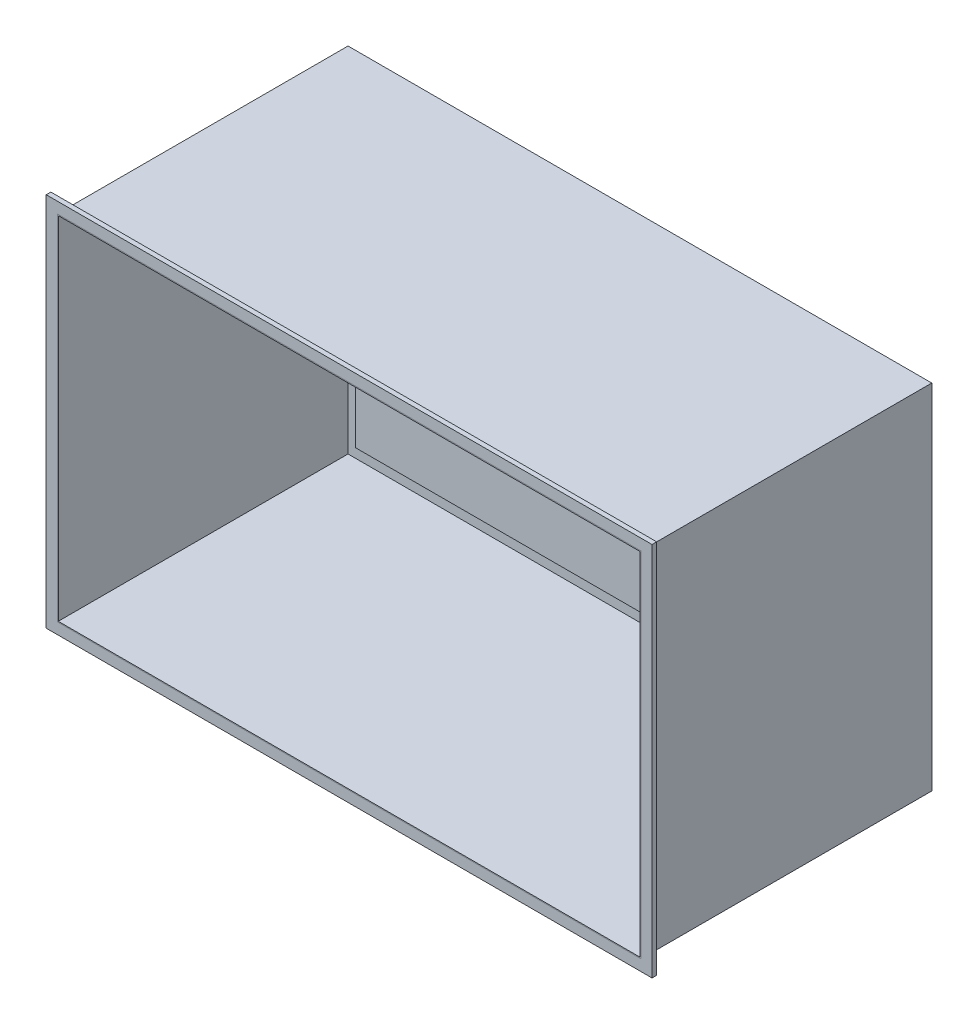
ISO-10303-21;
HEADER;
FILE_DESCRIPTION(('STEP AP214'),'2;1');
FILE_NAME('part.step','',(''),(''),'','','');
FILE_SCHEMA(('AUTOMOTIVE_DESIGN { 1 0 10303 214 1 1 1 1 }'));
ENDSEC;
DATA;
#1=APPLICATION_CONTEXT('core data for automotive mechanical design processes');
#2=APPLICATION_PROTOCOL_DEFINITION('international standard','automotive_design',2000,#1);
#3=PRODUCT_CONTEXT('',#1,'mechanical');
#4=PRODUCT('Part','Part','',(#3));
#5=PRODUCT_RELATED_PRODUCT_CATEGORY('part','',(#4));
#6=PRODUCT_DEFINITION_FORMATION('','',#4);
#7=PRODUCT_DEFINITION_CONTEXT('part definition',#1,'design');
#8=PRODUCT_DEFINITION('design','',#6,#7);
#9=PRODUCT_DEFINITION_SHAPE('','',#8);
#10=(LENGTH_UNIT() NAMED_UNIT(*) SI_UNIT(.MILLI.,.METRE.));
#11=(NAMED_UNIT(*) PLANE_ANGLE_UNIT() SI_UNIT($,.RADIAN.));
#12=(NAMED_UNIT(*) SI_UNIT($,.STERADIAN.) SOLID_ANGLE_UNIT());
#13=UNCERTAINTY_MEASURE_WITH_UNIT(LENGTH_MEASURE(1.E-05),#10,'distance_accuracy_value','');
#14=(GEOMETRIC_REPRESENTATION_CONTEXT(3) GLOBAL_UNCERTAINTY_ASSIGNED_CONTEXT((#13)) GLOBAL_UNIT_ASSIGNED_CONTEXT((#10,
#11,#12)) REPRESENTATION_CONTEXT('',''));
#15=CARTESIAN_POINT('',(0.,0.,0.));
#16=DIRECTION('',(0.,0.,1.));
#17=DIRECTION('',(1.,0.,0.));
#18=AXIS2_PLACEMENT_3D('',#15,#16,#17);
#19=CARTESIAN_POINT('',(411.5,-15.,168.69));
#20=DIRECTION('',(0.,-1.,0.));
#21=DIRECTION('',(1.,0.,0.));
#22=AXIS2_PLACEMENT_3D('',#19,#20,#21);
#23=PLANE('',#22);
#24=DIRECTION('',(1.,0.,0.));
#25=VECTOR('',#24,1.);
#26=CARTESIAN_POINT('',(411.5,-15.,175.));
#27=LINE('',#26,#25);
#28=CARTESIAN_POINT('',(-411.5,-15.0000000000001,175.));
#29=VERTEX_POINT('',#28);
#30=CARTESIAN_POINT('',(411.5,-15.,175.));
#31=VERTEX_POINT('',#30);
#32=EDGE_CURVE('E142',#29,#31,#27,.T.);
#33=ORIENTED_EDGE('',*,*,#32,.F.);
#34=DIRECTION('',(0.,0.,1.));
#35=VECTOR('',#34,1.);
#36=CARTESIAN_POINT('',(-411.5,-15.0000000000001,168.69));
#37=LINE('',#36,#35);
#38=CARTESIAN_POINT('',(-411.5,-15.0000000000001,168.69));
#39=VERTEX_POINT('',#38);
#40=EDGE_CURVE('E12',#39,#29,#37,.T.);
#41=ORIENTED_EDGE('',*,*,#40,.F.);
#42=DIRECTION('',(1.,0.,0.));
#43=VECTOR('',#42,1.);
#44=CARTESIAN_POINT('',(411.5,-15.,168.69));
#45=LINE('',#44,#43);
#46=CARTESIAN_POINT('',(411.5,-15.,168.69));
#47=VERTEX_POINT('',#46);
#48=EDGE_CURVE('E146',#39,#47,#45,.T.);
#49=ORIENTED_EDGE('',*,*,#48,.T.);
#50=DIRECTION('',(0.,0.,1.));
#51=VECTOR('',#50,1.);
#52=CARTESIAN_POINT('',(411.5,-15.,168.69));
#53=LINE('',#52,#51);
#54=EDGE_CURVE('E47',#47,#31,#53,.T.);
#55=ORIENTED_EDGE('',*,*,#54,.T.);
#56=EDGE_LOOP('',(#33,#41,#49,#55));
#57=FACE_BOUND('',#56,.T.);
#58=ADVANCED_FACE('F44',(#57),#23,.T.);
#59=CARTESIAN_POINT('',(-411.5,-15.0000000000001,168.69));
#60=DIRECTION('',(-1.,0.,0.));
#61=DIRECTION('',(0.,0.,1.));
#62=AXIS2_PLACEMENT_3D('',#59,#60,#61);
#63=PLANE('',#62);
#64=DIRECTION('',(0.,-1.,0.));
#65=VECTOR('',#64,1.);
#66=CARTESIAN_POINT('',(-411.5,-15.0000000000001,175.));
#67=LINE('',#66,#65);
#68=CARTESIAN_POINT('',(-411.5,495.,175.));
#69=VERTEX_POINT('',#68);
#70=EDGE_CURVE('E150',#69,#29,#67,.T.);
#71=ORIENTED_EDGE('',*,*,#70,.F.);
#72=DIRECTION('',(0.,0.,1.));
#73=VECTOR('',#72,1.);
#74=CARTESIAN_POINT('',(-411.5,495.,168.69));
#75=LINE('',#74,#73);
#76=CARTESIAN_POINT('',(-411.5,495.,168.69));
#77=VERTEX_POINT('',#76);
#78=EDGE_CURVE('E52',#77,#69,#75,.T.);
#79=ORIENTED_EDGE('',*,*,#78,.F.);
#80=DIRECTION('',(0.,-1.,0.));
#81=VECTOR('',#80,1.);
#82=CARTESIAN_POINT('',(-411.5,-15.0000000000001,168.69));
#83=LINE('',#82,#81);
#84=EDGE_CURVE('E156',#77,#39,#83,.T.);
#85=ORIENTED_EDGE('',*,*,#84,.T.);
#86=ORIENTED_EDGE('',*,*,#40,.T.);
#87=EDGE_LOOP('',(#71,#79,#85,#86));
#88=FACE_BOUND('',#87,.T.);
#89=ADVANCED_FACE('F182',(#88),#63,.T.);
#90=CARTESIAN_POINT('',(-411.5,495.,168.69));
#91=DIRECTION('',(0.,1.,0.));
#92=DIRECTION('',(0.,0.,1.));
#93=AXIS2_PLACEMENT_3D('',#90,#91,#92);
#94=PLANE('',#93);
#95=DIRECTION('',(-1.,0.,0.));
#96=VECTOR('',#95,1.);
#97=CARTESIAN_POINT('',(-411.5,495.,175.));
#98=LINE('',#97,#96);
#99=CARTESIAN_POINT('',(411.5,495.,175.));
#100=VERTEX_POINT('',#99);
#101=EDGE_CURVE('E164',#100,#69,#98,.T.);
#102=ORIENTED_EDGE('',*,*,#101,.F.);
#103=DIRECTION('',(0.,0.,1.));
#104=VECTOR('',#103,1.);
#105=CARTESIAN_POINT('',(411.5,495.,168.69));
#106=LINE('',#105,#104);
#107=CARTESIAN_POINT('',(411.5,495.,168.69));
#108=VERTEX_POINT('',#107);
#109=EDGE_CURVE('E169',#108,#100,#106,.T.);
#110=ORIENTED_EDGE('',*,*,#109,.F.);
#111=DIRECTION('',(-1.,0.,0.));
#112=VECTOR('',#111,1.);
#113=CARTESIAN_POINT('',(-411.5,495.,168.69));
#114=LINE('',#113,#112);
#115=EDGE_CURVE('E153',#108,#77,#114,.T.);
#116=ORIENTED_EDGE('',*,*,#115,.T.);
#117=ORIENTED_EDGE('',*,*,#78,.T.);
#118=EDGE_LOOP('',(#102,#110,#116,#117));
#119=FACE_BOUND('',#118,.T.);
#120=ADVANCED_FACE('F186',(#119),#94,.T.);
#121=CARTESIAN_POINT('',(411.5,495.,168.69));
#122=DIRECTION('',(1.,0.,0.));
#123=DIRECTION('',(0.,1.,0.));
#124=AXIS2_PLACEMENT_3D('',#121,#122,#123);
#125=PLANE('',#124);
#126=DIRECTION('',(0.,1.,0.));
#127=VECTOR('',#126,1.);
#128=CARTESIAN_POINT('',(411.5,495.,175.));
#129=LINE('',#128,#127);
#130=EDGE_CURVE('E161',#31,#100,#129,.T.);
#131=ORIENTED_EDGE('',*,*,#130,.F.);
#132=ORIENTED_EDGE('',*,*,#54,.F.);
#133=DIRECTION('',(0.,1.,0.));
#134=VECTOR('',#133,1.);
#135=CARTESIAN_POINT('',(411.5,495.,168.69));
#136=LINE('',#135,#134);
#137=EDGE_CURVE('E149',#47,#108,#136,.T.);
#138=ORIENTED_EDGE('',*,*,#137,.T.);
#139=ORIENTED_EDGE('',*,*,#109,.T.);
#140=EDGE_LOOP('',(#131,#132,#138,#139));
#141=FACE_BOUND('',#140,.T.);
#142=ADVANCED_FACE('F177',(#141),#125,.T.);
#143=CARTESIAN_POINT('',(0.,0.,168.69));
#144=DIRECTION('',(0.,0.,-1.));
#145=DIRECTION('',(-1.,0.,0.));
#146=AXIS2_PLACEMENT_3D('',#143,#144,#145);
#147=PLANE('',#146);
#148=DIRECTION('',(0.,-1.,0.));
#149=VECTOR('',#148,1.);
#150=CARTESIAN_POINT('',(-396.5,0.,168.69));
#151=LINE('',#150,#149);
#152=CARTESIAN_POINT('',(-396.5,480.,168.69));
#153=VERTEX_POINT('',#152);
#154=CARTESIAN_POINT('',(-396.5,0.,168.69));
#155=VERTEX_POINT('',#154);
#156=EDGE_CURVE('E111',#153,#155,#151,.T.);
#157=ORIENTED_EDGE('',*,*,#156,.T.);
#158=DIRECTION('',(1.,0.,0.));
#159=VECTOR('',#158,1.);
#160=CARTESIAN_POINT('',(396.5,0.,168.69));
#161=LINE('',#160,#159);
#162=CARTESIAN_POINT('',(396.5,0.,168.69));
#163=VERTEX_POINT('',#162);
#164=EDGE_CURVE('E120',#155,#163,#161,.T.);
#165=ORIENTED_EDGE('',*,*,#164,.T.);
#166=DIRECTION('',(0.,1.,0.));
#167=VECTOR('',#166,1.);
#168=CARTESIAN_POINT('',(396.5,480.,168.69));
#169=LINE('',#168,#167);
#170=CARTESIAN_POINT('',(396.5,480.,168.69));
#171=VERTEX_POINT('',#170);
#172=EDGE_CURVE('E60',#163,#171,#169,.T.);
#173=ORIENTED_EDGE('',*,*,#172,.T.);
#174=DIRECTION('',(-1.,0.,0.));
#175=VECTOR('',#174,1.);
#176=CARTESIAN_POINT('',(-396.5,480.,168.69));
#177=LINE('',#176,#175);
#178=EDGE_CURVE('E117',#171,#153,#177,.T.);
#179=ORIENTED_EDGE('',*,*,#178,.T.);
#180=EDGE_LOOP('',(#157,#165,#173,#179));
#181=FACE_BOUND('',#180,.T.);
#182=ORIENTED_EDGE('',*,*,#48,.F.);
#183=ORIENTED_EDGE('',*,*,#84,.F.);
#184=ORIENTED_EDGE('',*,*,#115,.F.);
#185=ORIENTED_EDGE('',*,*,#137,.F.);
#186=EDGE_LOOP('',(#182,#183,#184,#185));
#187=FACE_BOUND('',#186,.T.);
#188=ADVANCED_FACE('F124',(#181,#187),#147,.T.);
#189=CARTESIAN_POINT('',(0.,0.,175.));
#190=DIRECTION('',(0.,0.,-1.));
#191=DIRECTION('',(-1.,0.,0.));
#192=AXIS2_PLACEMENT_3D('',#189,#190,#191);
#193=PLANE('',#192);
#194=DIRECTION('',(1.,0.,0.));
#195=VECTOR('',#194,1.);
#196=CARTESIAN_POINT('',(396.5,0.,175.));
#197=LINE('',#196,#195);
#198=CARTESIAN_POINT('',(-396.5,0.,175.));
#199=VERTEX_POINT('',#198);
#200=CARTESIAN_POINT('',(396.5,0.,175.));
#201=VERTEX_POINT('',#200);
#202=EDGE_CURVE('E136',#199,#201,#197,.T.);
#203=ORIENTED_EDGE('',*,*,#202,.F.);
#204=DIRECTION('',(0.,-1.,0.));
#205=VECTOR('',#204,1.);
#206=CARTESIAN_POINT('',(-396.5,0.,175.));
#207=LINE('',#206,#205);
#208=CARTESIAN_POINT('',(-396.5,480.,175.));
#209=VERTEX_POINT('',#208);
#210=EDGE_CURVE('E68',#209,#199,#207,.T.);
#211=ORIENTED_EDGE('',*,*,#210,.F.);
#212=DIRECTION('',(-1.,0.,0.));
#213=VECTOR('',#212,1.);
#214=CARTESIAN_POINT('',(-396.5,480.,175.));
#215=LINE('',#214,#213);
#216=CARTESIAN_POINT('',(396.5,480.,175.));
#217=VERTEX_POINT('',#216);
#218=EDGE_CURVE('E127',#217,#209,#215,.T.);
#219=ORIENTED_EDGE('',*,*,#218,.F.);
#220=DIRECTION('',(0.,1.,0.));
#221=VECTOR('',#220,1.);
#222=CARTESIAN_POINT('',(396.5,480.,175.));
#223=LINE('',#222,#221);
#224=EDGE_CURVE('E130',#201,#217,#223,.T.);
#225=ORIENTED_EDGE('',*,*,#224,.F.);
#226=EDGE_LOOP('',(#203,#211,#219,#225));
#227=FACE_BOUND('',#226,.T.);
#228=ORIENTED_EDGE('',*,*,#32,.T.);
#229=ORIENTED_EDGE('',*,*,#130,.T.);
#230=ORIENTED_EDGE('',*,*,#101,.T.);
#231=ORIENTED_EDGE('',*,*,#70,.T.);
#232=EDGE_LOOP('',(#228,#229,#230,#231));
#233=FACE_BOUND('',#232,.T.);
#234=ADVANCED_FACE('F179',(#227,#233),#193,.F.);
#235=CARTESIAN_POINT('',(-396.5,0.,168.69));
#236=DIRECTION('',(-1.,0.,0.));
#237=DIRECTION('',(0.,0.,1.));
#238=AXIS2_PLACEMENT_3D('',#235,#236,#237);
#239=PLANE('',#238);
#240=ORIENTED_EDGE('',*,*,#210,.T.);
#241=DIRECTION('',(0.,0.,1.));
#242=VECTOR('',#241,1.);
#243=CARTESIAN_POINT('',(-396.5,0.,168.69));
#244=LINE('',#243,#242);
#245=EDGE_CURVE('E107',#155,#199,#244,.T.);
#246=ORIENTED_EDGE('',*,*,#245,.F.);
#247=ORIENTED_EDGE('',*,*,#156,.F.);
#248=DIRECTION('',(0.,0.,1.));
#249=VECTOR('',#248,1.);
#250=CARTESIAN_POINT('',(-396.5,480.,168.69));
#251=LINE('',#250,#249);
#252=EDGE_CURVE('E140',#153,#209,#251,.T.);
#253=ORIENTED_EDGE('',*,*,#252,.T.);
#254=EDGE_LOOP('',(#240,#246,#247,#253));
#255=FACE_BOUND('',#254,.T.);
#256=ADVANCED_FACE('F109',(#255),#239,.F.);
#257=CARTESIAN_POINT('',(-396.5,480.,168.69));
#258=DIRECTION('',(0.,1.,0.));
#259=DIRECTION('',(0.,0.,1.));
#260=AXIS2_PLACEMENT_3D('',#257,#258,#259);
#261=PLANE('',#260);
#262=ORIENTED_EDGE('',*,*,#218,.T.);
#263=ORIENTED_EDGE('',*,*,#252,.F.);
#264=ORIENTED_EDGE('',*,*,#178,.F.);
#265=DIRECTION('',(0.,0.,1.));
#266=VECTOR('',#265,1.);
#267=CARTESIAN_POINT('',(396.5,480.,168.69));
#268=LINE('',#267,#266);
#269=EDGE_CURVE('E143',#171,#217,#268,.T.);
#270=ORIENTED_EDGE('',*,*,#269,.T.);
#271=EDGE_LOOP('',(#262,#263,#264,#270));
#272=FACE_BOUND('',#271,.T.);
#273=ADVANCED_FACE('F237',(#272),#261,.F.);
#274=CARTESIAN_POINT('',(396.5,480.,168.69));
#275=DIRECTION('',(1.,0.,0.));
#276=DIRECTION('',(0.,0.,-1.));
#277=AXIS2_PLACEMENT_3D('',#274,#275,#276);
#278=PLANE('',#277);
#279=ORIENTED_EDGE('',*,*,#224,.T.);
#280=ORIENTED_EDGE('',*,*,#269,.F.);
#281=ORIENTED_EDGE('',*,*,#172,.F.);
#282=DIRECTION('',(0.,0.,1.));
#283=VECTOR('',#282,1.);
#284=CARTESIAN_POINT('',(396.5,0.,168.69));
#285=LINE('',#284,#283);
#286=EDGE_CURVE('E116',#163,#201,#285,.T.);
#287=ORIENTED_EDGE('',*,*,#286,.T.);
#288=EDGE_LOOP('',(#279,#280,#281,#287));
#289=FACE_BOUND('',#288,.T.);
#290=ADVANCED_FACE('F246',(#289),#278,.F.);
#291=CARTESIAN_POINT('',(396.5,0.,168.69));
#292=DIRECTION('',(0.,-1.,0.));
#293=DIRECTION('',(0.,0.,-1.));
#294=AXIS2_PLACEMENT_3D('',#291,#292,#293);
#295=PLANE('',#294);
#296=ORIENTED_EDGE('',*,*,#202,.T.);
#297=ORIENTED_EDGE('',*,*,#286,.F.);
#298=ORIENTED_EDGE('',*,*,#164,.F.);
#299=ORIENTED_EDGE('',*,*,#245,.T.);
#300=EDGE_LOOP('',(#296,#297,#298,#299));
#301=FACE_BOUND('',#300,.T.);
#302=ADVANCED_FACE('F121',(#301),#295,.F.);
#303=CLOSED_SHELL('',(#58,#89,#120,#142,#188,#234,#256,#273,#290,#302));
#304=MANIFOLD_SOLID_BREP('B2',#303);
#305=CARTESIAN_POINT('',(396.5,480.,-220.));
#306=DIRECTION('',(-1.,0.,0.));
#307=DIRECTION('',(0.,0.,1.));
#308=AXIS2_PLACEMENT_3D('',#305,#306,#307);
#309=PLANE('',#308);
#310=DIRECTION('',(0.,0.,-1.));
#311=VECTOR('',#310,1.);
#312=CARTESIAN_POINT('',(396.5,480.,-220.));
#313=LINE('',#312,#311);
#314=CARTESIAN_POINT('',(396.5,480.,175.));
#315=VERTEX_POINT('',#314);
#316=CARTESIAN_POINT('',(396.5,480.,-220.));
#317=VERTEX_POINT('',#316);
#318=EDGE_CURVE('E435',#315,#317,#313,.T.);
#319=ORIENTED_EDGE('',*,*,#318,.F.);
#320=DIRECTION('',(0.,1.,0.));
#321=VECTOR('',#320,1.);
#322=CARTESIAN_POINT('',(396.5,0.,175.));
#323=LINE('',#322,#321);
#324=CARTESIAN_POINT('',(396.5,0.,175.));
#325=VERTEX_POINT('',#324);
#326=EDGE_CURVE('E395',#325,#315,#323,.T.);
#327=ORIENTED_EDGE('',*,*,#326,.F.);
#328=DIRECTION('',(0.,0.,-1.));
#329=VECTOR('',#328,1.);
#330=CARTESIAN_POINT('',(396.5,0.,-220.));
#331=LINE('',#330,#329);
#332=CARTESIAN_POINT('',(396.5,0.,-220.));
#333=VERTEX_POINT('',#332);
#334=EDGE_CURVE('E420',#325,#333,#331,.T.);
#335=ORIENTED_EDGE('',*,*,#334,.T.);
#336=DIRECTION('',(0.,-1.,0.));
#337=VECTOR('',#336,1.);
#338=CARTESIAN_POINT('',(396.5,480.,-220.));
#339=LINE('',#338,#337);
#340=EDGE_CURVE('E451',#317,#333,#339,.T.);
#341=ORIENTED_EDGE('',*,*,#340,.F.);
#342=EDGE_LOOP('',(#319,#327,#335,#341));
#343=FACE_BOUND('',#342,.T.);
#344=ADVANCED_FACE('F273',(#343),#309,.F.);
#345=CARTESIAN_POINT('',(-396.5,480.,-220.));
#346=DIRECTION('',(0.,0.,1.));
#347=DIRECTION('',(1.,0.,0.));
#348=AXIS2_PLACEMENT_3D('',#345,#346,#347);
#349=PLANE('',#348);
#350=DIRECTION('',(-1.,0.,0.));
#351=VECTOR('',#350,1.);
#352=CARTESIAN_POINT('',(-396.5,0.,-220.));
#353=LINE('',#352,#351);
#354=CARTESIAN_POINT('',(-396.5,0.,-220.));
#355=VERTEX_POINT('',#354);
#356=EDGE_CURVE('E445',#333,#355,#353,.T.);
#357=ORIENTED_EDGE('',*,*,#356,.T.);
#358=DIRECTION('',(0.,-1.,0.));
#359=VECTOR('',#358,1.);
#360=CARTESIAN_POINT('',(-396.5,480.,-220.));
#361=LINE('',#360,#359);
#362=CARTESIAN_POINT('',(-396.5,480.,-220.));
#363=VERTEX_POINT('',#362);
#364=EDGE_CURVE('E443',#363,#355,#361,.T.);
#365=ORIENTED_EDGE('',*,*,#364,.F.);
#366=DIRECTION('',(-1.,0.,0.));
#367=VECTOR('',#366,1.);
#368=CARTESIAN_POINT('',(-396.5,480.,-220.));
#369=LINE('',#368,#367);
#370=EDGE_CURVE('E437',#317,#363,#369,.T.);
#371=ORIENTED_EDGE('',*,*,#370,.F.);
#372=ORIENTED_EDGE('',*,*,#340,.T.);
#373=EDGE_LOOP('',(#357,#365,#371,#372));
#374=FACE_BOUND('',#373,.T.);
#375=ADVANCED_FACE('F504',(#374),#349,.F.);
#376=CARTESIAN_POINT('',(-396.5,480.,-220.));
#377=DIRECTION('',(1.,0.,0.));
#378=DIRECTION('',(0.,0.,-1.));
#379=AXIS2_PLACEMENT_3D('',#376,#377,#378);
#380=PLANE('',#379);
#381=DIRECTION('',(0.,0.,1.));
#382=VECTOR('',#381,1.);
#383=CARTESIAN_POINT('',(-396.5,0.,-220.));
#384=LINE('',#383,#382);
#385=CARTESIAN_POINT('',(-396.5,0.,175.));
#386=VERTEX_POINT('',#385);
#387=EDGE_CURVE('E438',#355,#386,#384,.T.);
#388=ORIENTED_EDGE('',*,*,#387,.T.);
#389=DIRECTION('',(0.,-1.,0.));
#390=VECTOR('',#389,1.);
#391=CARTESIAN_POINT('',(-396.5,0.,175.));
#392=LINE('',#391,#390);
#393=CARTESIAN_POINT('',(-396.5,480.,175.));
#394=VERTEX_POINT('',#393);
#395=EDGE_CURVE('E403',#394,#386,#392,.T.);
#396=ORIENTED_EDGE('',*,*,#395,.F.);
#397=DIRECTION('',(0.,0.,1.));
#398=VECTOR('',#397,1.);
#399=CARTESIAN_POINT('',(-396.5,480.,-220.));
#400=LINE('',#399,#398);
#401=EDGE_CURVE('E440',#363,#394,#400,.T.);
#402=ORIENTED_EDGE('',*,*,#401,.F.);
#403=ORIENTED_EDGE('',*,*,#364,.T.);
#404=EDGE_LOOP('',(#388,#396,#402,#403));
#405=FACE_BOUND('',#404,.T.);
#406=ADVANCED_FACE('F502',(#405),#380,.F.);
#407=CARTESIAN_POINT('',(0.,480.,0.));
#408=DIRECTION('',(0.,1.,0.));
#409=DIRECTION('',(0.,0.,1.));
#410=AXIS2_PLACEMENT_3D('',#407,#408,#409);
#411=PLANE('',#410);
#412=DIRECTION('',(-1.,0.,0.));
#413=VECTOR('',#412,1.);
#414=CARTESIAN_POINT('',(-396.5,480.,175.));
#415=LINE('',#414,#413);
#416=EDGE_CURVE('E401',#315,#394,#415,.T.);
#417=ORIENTED_EDGE('',*,*,#416,.F.);
#418=ORIENTED_EDGE('',*,*,#318,.T.);
#419=ORIENTED_EDGE('',*,*,#370,.T.);
#420=ORIENTED_EDGE('',*,*,#401,.T.);
#421=EDGE_LOOP('',(#417,#418,#419,#420));
#422=FACE_BOUND('',#421,.T.);
#423=ADVANCED_FACE('F478',(#422),#411,.T.);
#424=CARTESIAN_POINT('',(0.,0.,0.));
#425=DIRECTION('',(0.,1.,0.));
#426=DIRECTION('',(0.,0.,1.));
#427=AXIS2_PLACEMENT_3D('',#424,#425,#426);
#428=PLANE('',#427);
#429=CARTESIAN_POINT('',(372.5,0.,-67.4));
#430=DIRECTION('',(0.,-1.,0.));
#431=DIRECTION('',(0.,0.,-1.));
#432=AXIS2_PLACEMENT_3D('',#429,#430,#431);
#433=CIRCLE('',#432,12.7);
#434=CARTESIAN_POINT('',(372.5,0.,-80.1));
#435=VERTEX_POINT('',#434);
#436=EDGE_CURVE('E460',#435,#435,#433,.T.);
#437=ORIENTED_EDGE('',*,*,#436,.F.);
#438=EDGE_LOOP('',(#437));
#439=FACE_BOUND('',#438,.T.);
#440=CARTESIAN_POINT('',(372.5,0.,-17.));
#441=DIRECTION('',(0.,-1.,0.));
#442=DIRECTION('',(0.,0.,-1.));
#443=AXIS2_PLACEMENT_3D('',#440,#441,#442);
#444=CIRCLE('',#443,12.7);
#445=CARTESIAN_POINT('',(372.5,0.,-29.7));
#446=VERTEX_POINT('',#445);
#447=EDGE_CURVE('E465',#446,#446,#444,.T.);
#448=ORIENTED_EDGE('',*,*,#447,.F.);
#449=EDGE_LOOP('',(#448));
#450=FACE_BOUND('',#449,.T.);
#451=CARTESIAN_POINT('',(372.5,0.,-117.8));
#452=DIRECTION('',(0.,-1.,0.));
#453=DIRECTION('',(0.,0.,-1.));
#454=AXIS2_PLACEMENT_3D('',#451,#452,#453);
#455=CIRCLE('',#454,12.7);
#456=CARTESIAN_POINT('',(372.5,0.,-130.5));
#457=VERTEX_POINT('',#456);
#458=EDGE_CURVE('E387',#457,#457,#455,.T.);
#459=ORIENTED_EDGE('',*,*,#458,.F.);
#460=EDGE_LOOP('',(#459));
#461=FACE_BOUND('',#460,.T.);
#462=ORIENTED_EDGE('',*,*,#334,.F.);
#463=DIRECTION('',(1.,0.,0.));
#464=VECTOR('',#463,1.);
#465=CARTESIAN_POINT('',(-396.5,0.,175.));
#466=LINE('',#465,#464);
#467=EDGE_CURVE('E405',#386,#325,#466,.T.);
#468=ORIENTED_EDGE('',*,*,#467,.F.);
#469=ORIENTED_EDGE('',*,*,#387,.F.);
#470=ORIENTED_EDGE('',*,*,#356,.F.);
#471=EDGE_LOOP('',(#462,#468,#469,#470));
#472=FACE_BOUND('',#471,.T.);
#473=ADVANCED_FACE('F474',(#439,#450,#461,#472),#428,.F.);
#474=CARTESIAN_POINT('',(395.14,480.,-220.));
#475=DIRECTION('',(-1.,0.,0.));
#476=DIRECTION('',(0.,0.,1.));
#477=AXIS2_PLACEMENT_3D('',#474,#475,#476);
#478=PLANE('',#477);
#479=DIRECTION('',(0.,-1.,0.));
#480=VECTOR('',#479,1.);
#481=CARTESIAN_POINT('',(395.14,480.,175.));
#482=LINE('',#481,#480);
#483=CARTESIAN_POINT('',(395.14,478.64,175.));
#484=VERTEX_POINT('',#483);
#485=CARTESIAN_POINT('',(395.14,1.36000000000003,175.));
#486=VERTEX_POINT('',#485);
#487=EDGE_CURVE('E409',#484,#486,#482,.T.);
#488=ORIENTED_EDGE('',*,*,#487,.F.);
#489=DIRECTION('',(0.,0.,-1.));
#490=VECTOR('',#489,1.);
#491=CARTESIAN_POINT('',(395.14,478.64,-220.));
#492=LINE('',#491,#490);
#493=CARTESIAN_POINT('',(395.14,478.64,-218.64));
#494=VERTEX_POINT('',#493);
#495=EDGE_CURVE('E422',#484,#494,#492,.T.);
#496=ORIENTED_EDGE('',*,*,#495,.T.);
#497=DIRECTION('',(0.,-1.,0.));
#498=VECTOR('',#497,1.);
#499=CARTESIAN_POINT('',(395.14,480.,-218.64));
#500=LINE('',#499,#498);
#501=CARTESIAN_POINT('',(395.14,1.36,-218.64));
#502=VERTEX_POINT('',#501);
#503=EDGE_CURVE('E417',#494,#502,#500,.T.);
#504=ORIENTED_EDGE('',*,*,#503,.T.);
#505=DIRECTION('',(0.,0.,-1.));
#506=VECTOR('',#505,1.);
#507=CARTESIAN_POINT('',(395.14,1.36000000000003,-220.));
#508=LINE('',#507,#506);
#509=EDGE_CURVE('E414',#486,#502,#508,.T.);
#510=ORIENTED_EDGE('',*,*,#509,.F.);
#511=EDGE_LOOP('',(#488,#496,#504,#510));
#512=FACE_BOUND('',#511,.T.);
#513=ADVANCED_FACE('F477',(#512),#478,.T.);
#514=CARTESIAN_POINT('',(-396.5,480.,-218.64));
#515=DIRECTION('',(0.,0.,1.));
#516=DIRECTION('',(1.,0.,0.));
#517=AXIS2_PLACEMENT_3D('',#514,#515,#516);
#518=PLANE('',#517);
#519=DIRECTION('',(0.,-1.,0.));
#520=VECTOR('',#519,1.);
#521=CARTESIAN_POINT('',(-379.435502159656,480.,-218.64));
#522=LINE('',#521,#520);
#523=CARTESIAN_POINT('',(-379.435502159656,466.769078929809,-218.64));
#524=VERTEX_POINT('',#523);
#525=CARTESIAN_POINT('',(-379.435502159656,19.444734610378,-218.64));
#526=VERTEX_POINT('',#525);
#527=EDGE_CURVE('E42',#524,#526,#522,.T.);
#528=ORIENTED_EDGE('',*,*,#527,.F.);
#529=DIRECTION('',(-1.,0.,0.));
#530=VECTOR('',#529,1.);
#531=CARTESIAN_POINT('',(-396.5,466.769078929809,-218.64));
#532=LINE('',#531,#530);
#533=CARTESIAN_POINT('',(375.280437732553,466.769078929809,-218.64));
#534=VERTEX_POINT('',#533);
#535=EDGE_CURVE('E365',#534,#524,#532,.T.);
#536=ORIENTED_EDGE('',*,*,#535,.F.);
#537=DIRECTION('',(0.,1.,0.));
#538=VECTOR('',#537,1.);
#539=CARTESIAN_POINT('',(375.280437732553,480.,-218.64));
#540=LINE('',#539,#538);
#541=CARTESIAN_POINT('',(375.280437732553,19.444734610378,-218.64));
#542=VERTEX_POINT('',#541);
#543=EDGE_CURVE('E292',#542,#534,#540,.T.);
#544=ORIENTED_EDGE('',*,*,#543,.F.);
#545=DIRECTION('',(1.,0.,0.));
#546=VECTOR('',#545,1.);
#547=CARTESIAN_POINT('',(-396.5,19.444734610378,-218.64));
#548=LINE('',#547,#546);
#549=EDGE_CURVE('E281',#526,#542,#548,.T.);
#550=ORIENTED_EDGE('',*,*,#549,.F.);
#551=EDGE_LOOP('',(#528,#536,#544,#550));
#552=FACE_BOUND('',#551,.T.);
#553=DIRECTION('',(-1.,0.,0.));
#554=VECTOR('',#553,1.);
#555=CARTESIAN_POINT('',(-396.5,1.36000000000003,-218.64));
#556=LINE('',#555,#554);
#557=CARTESIAN_POINT('',(-395.14,1.36,-218.64));
#558=VERTEX_POINT('',#557);
#559=EDGE_CURVE('E416',#502,#558,#556,.T.);
#560=ORIENTED_EDGE('',*,*,#559,.F.);
#561=ORIENTED_EDGE('',*,*,#503,.F.);
#562=DIRECTION('',(-1.,0.,0.));
#563=VECTOR('',#562,1.);
#564=CARTESIAN_POINT('',(-396.5,478.64,-218.64));
#565=LINE('',#564,#563);
#566=CARTESIAN_POINT('',(-395.14,478.64,-218.64));
#567=VERTEX_POINT('',#566);
#568=EDGE_CURVE('E424',#494,#567,#565,.T.);
#569=ORIENTED_EDGE('',*,*,#568,.T.);
#570=DIRECTION('',(0.,-1.,0.));
#571=VECTOR('',#570,1.);
#572=CARTESIAN_POINT('',(-395.14,480.,-218.64));
#573=LINE('',#572,#571);
#574=EDGE_CURVE('E421',#567,#558,#573,.T.);
#575=ORIENTED_EDGE('',*,*,#574,.T.);
#576=EDGE_LOOP('',(#560,#561,#569,#575));
#577=FACE_BOUND('',#576,.T.);
#578=ADVANCED_FACE('F525',(#552,#577),#518,.T.);
#579=CARTESIAN_POINT('',(-395.14,480.,-220.));
#580=DIRECTION('',(1.,0.,0.));
#581=DIRECTION('',(0.,0.,-1.));
#582=AXIS2_PLACEMENT_3D('',#579,#580,#581);
#583=PLANE('',#582);
#584=DIRECTION('',(0.,1.,0.));
#585=VECTOR('',#584,1.);
#586=CARTESIAN_POINT('',(-395.14,480.,175.));
#587=LINE('',#586,#585);
#588=CARTESIAN_POINT('',(-395.14,1.36,175.));
#589=VERTEX_POINT('',#588);
#590=CARTESIAN_POINT('',(-395.14,478.64,175.));
#591=VERTEX_POINT('',#590);
#592=EDGE_CURVE('E407',#589,#591,#587,.T.);
#593=ORIENTED_EDGE('',*,*,#592,.F.);
#594=DIRECTION('',(0.,0.,1.));
#595=VECTOR('',#594,1.);
#596=CARTESIAN_POINT('',(-395.14,1.36000000000003,-220.));
#597=LINE('',#596,#595);
#598=EDGE_CURVE('E425',#558,#589,#597,.T.);
#599=ORIENTED_EDGE('',*,*,#598,.F.);
#600=ORIENTED_EDGE('',*,*,#574,.F.);
#601=DIRECTION('',(0.,0.,1.));
#602=VECTOR('',#601,1.);
#603=CARTESIAN_POINT('',(-395.14,478.64,-220.));
#604=LINE('',#603,#602);
#605=EDGE_CURVE('E429',#567,#591,#604,.T.);
#606=ORIENTED_EDGE('',*,*,#605,.T.);
#607=EDGE_LOOP('',(#593,#599,#600,#606));
#608=FACE_BOUND('',#607,.T.);
#609=ADVANCED_FACE('F521',(#608),#583,.T.);
#610=CARTESIAN_POINT('',(0.,478.64,0.));
#611=DIRECTION('',(0.,1.,0.));
#612=DIRECTION('',(0.,0.,1.));
#613=AXIS2_PLACEMENT_3D('',#610,#611,#612);
#614=PLANE('',#613);
#615=ORIENTED_EDGE('',*,*,#495,.F.);
#616=DIRECTION('',(-1.,0.,0.));
#617=VECTOR('',#616,1.);
#618=CARTESIAN_POINT('',(0.,478.64,175.));
#619=LINE('',#618,#617);
#620=EDGE_CURVE('E411',#484,#591,#619,.T.);
#621=ORIENTED_EDGE('',*,*,#620,.T.);
#622=ORIENTED_EDGE('',*,*,#605,.F.);
#623=ORIENTED_EDGE('',*,*,#568,.F.);
#624=EDGE_LOOP('',(#615,#621,#622,#623));
#625=FACE_BOUND('',#624,.T.);
#626=ADVANCED_FACE('F517',(#625),#614,.F.);
#627=CARTESIAN_POINT('',(0.,1.36,0.));
#628=DIRECTION('',(0.,1.,0.));
#629=DIRECTION('',(0.,0.,1.));
#630=AXIS2_PLACEMENT_3D('',#627,#628,#629);
#631=PLANE('',#630);
#632=CARTESIAN_POINT('',(372.5,1.36,-67.4));
#633=DIRECTION('',(0.,1.,0.));
#634=DIRECTION('',(0.,0.,1.));
#635=AXIS2_PLACEMENT_3D('',#632,#633,#634);
#636=CIRCLE('',#635,12.7);
#637=CARTESIAN_POINT('',(372.5,1.36,-54.7));
#638=VERTEX_POINT('',#637);
#639=EDGE_CURVE('E276',#638,#638,#636,.T.);
#640=ORIENTED_EDGE('',*,*,#639,.F.);
#641=EDGE_LOOP('',(#640));
#642=FACE_BOUND('',#641,.T.);
#643=CARTESIAN_POINT('',(372.5,1.36,-17.));
#644=DIRECTION('',(0.,1.,0.));
#645=DIRECTION('',(0.,0.,1.));
#646=AXIS2_PLACEMENT_3D('',#643,#644,#645);
#647=CIRCLE('',#646,12.7);
#648=CARTESIAN_POINT('',(372.5,1.36,-4.30000000000001));
#649=VERTEX_POINT('',#648);
#650=EDGE_CURVE('E458',#649,#649,#647,.T.);
#651=ORIENTED_EDGE('',*,*,#650,.F.);
#652=EDGE_LOOP('',(#651));
#653=FACE_BOUND('',#652,.T.);
#654=CARTESIAN_POINT('',(372.5,1.36,-117.8));
#655=DIRECTION('',(0.,1.,0.));
#656=DIRECTION('',(0.,0.,1.));
#657=AXIS2_PLACEMENT_3D('',#654,#655,#656);
#658=CIRCLE('',#657,12.7);
#659=CARTESIAN_POINT('',(372.5,1.36,-105.1));
#660=VERTEX_POINT('',#659);
#661=EDGE_CURVE('E384',#660,#660,#658,.T.);
#662=ORIENTED_EDGE('',*,*,#661,.F.);
#663=EDGE_LOOP('',(#662));
#664=FACE_BOUND('',#663,.T.);
#665=DIRECTION('',(-1.,0.,0.));
#666=VECTOR('',#665,1.);
#667=CARTESIAN_POINT('',(0.,1.36,175.));
#668=LINE('',#667,#666);
#669=EDGE_CURVE('E454',#486,#589,#668,.T.);
#670=ORIENTED_EDGE('',*,*,#669,.F.);
#671=ORIENTED_EDGE('',*,*,#509,.T.);
#672=ORIENTED_EDGE('',*,*,#559,.T.);
#673=ORIENTED_EDGE('',*,*,#598,.T.);
#674=EDGE_LOOP('',(#670,#671,#672,#673));
#675=FACE_BOUND('',#674,.T.);
#676=ADVANCED_FACE('F514',(#642,#653,#664,#675),#631,.T.);
#677=CARTESIAN_POINT('',(0.,0.,175.));
#678=DIRECTION('',(0.,0.,-1.));
#679=DIRECTION('',(-1.,0.,0.));
#680=AXIS2_PLACEMENT_3D('',#677,#678,#679);
#681=PLANE('',#680);
#682=ORIENTED_EDGE('',*,*,#326,.T.);
#683=ORIENTED_EDGE('',*,*,#416,.T.);
#684=ORIENTED_EDGE('',*,*,#395,.T.);
#685=ORIENTED_EDGE('',*,*,#467,.T.);
#686=EDGE_LOOP('',(#682,#683,#684,#685));
#687=FACE_BOUND('',#686,.T.);
#688=ORIENTED_EDGE('',*,*,#487,.T.);
#689=ORIENTED_EDGE('',*,*,#669,.T.);
#690=ORIENTED_EDGE('',*,*,#592,.T.);
#691=ORIENTED_EDGE('',*,*,#620,.F.);
#692=EDGE_LOOP('',(#688,#689,#690,#691));
#693=FACE_BOUND('',#692,.T.);
#694=ADVANCED_FACE('F494',(#687,#693),#681,.F.);
#695=CARTESIAN_POINT('',(-379.435502159656,466.769078929809,-213.));
#696=DIRECTION('',(-1.,0.,0.));
#697=DIRECTION('',(0.,0.,1.));
#698=AXIS2_PLACEMENT_3D('',#695,#696,#697);
#699=PLANE('',#698);
#700=DIRECTION('',(0.,0.,-1.));
#701=VECTOR('',#700,1.);
#702=CARTESIAN_POINT('',(-379.435502159656,466.769078929809,-213.));
#703=LINE('',#702,#701);
#704=CARTESIAN_POINT('',(-379.435502159656,466.769078929809,-213.));
#705=VERTEX_POINT('',#704);
#706=EDGE_CURVE('E360',#705,#524,#703,.T.);
#707=ORIENTED_EDGE('',*,*,#706,.T.);
#708=ORIENTED_EDGE('',*,*,#527,.T.);
#709=DIRECTION('',(0.,0.,-1.));
#710=VECTOR('',#709,1.);
#711=CARTESIAN_POINT('',(-379.435502159656,19.4447346103781,-213.));
#712=LINE('',#711,#710);
#713=CARTESIAN_POINT('',(-379.435502159656,19.4447346103781,-213.));
#714=VERTEX_POINT('',#713);
#715=EDGE_CURVE('E383',#714,#526,#712,.T.);
#716=ORIENTED_EDGE('',*,*,#715,.F.);
#717=DIRECTION('',(0.,1.,0.));
#718=VECTOR('',#717,1.);
#719=CARTESIAN_POINT('',(-379.435502159656,466.769078929809,-213.));
#720=LINE('',#719,#718);
#721=EDGE_CURVE('E376',#714,#705,#720,.T.);
#722=ORIENTED_EDGE('',*,*,#721,.T.);
#723=EDGE_LOOP('',(#707,#708,#716,#722));
#724=FACE_BOUND('',#723,.T.);
#725=ADVANCED_FACE('F381',(#724),#699,.T.);
#726=CARTESIAN_POINT('',(375.280437732553,19.4447346103781,-213.));
#727=DIRECTION('',(0.,-1.,0.));
#728=DIRECTION('',(0.,0.,-1.));
#729=AXIS2_PLACEMENT_3D('',#726,#727,#728);
#730=PLANE('',#729);
#731=ORIENTED_EDGE('',*,*,#715,.T.);
#732=ORIENTED_EDGE('',*,*,#549,.T.);
#733=DIRECTION('',(0.,0.,-1.));
#734=VECTOR('',#733,1.);
#735=CARTESIAN_POINT('',(375.280437732553,19.4447346103781,-213.));
#736=LINE('',#735,#734);
#737=CARTESIAN_POINT('',(375.280437732553,19.4447346103781,-213.));
#738=VERTEX_POINT('',#737);
#739=EDGE_CURVE('E396',#738,#542,#736,.T.);
#740=ORIENTED_EDGE('',*,*,#739,.F.);
#741=DIRECTION('',(-1.,0.,0.));
#742=VECTOR('',#741,1.);
#743=CARTESIAN_POINT('',(375.280437732553,19.4447346103781,-213.));
#744=LINE('',#743,#742);
#745=EDGE_CURVE('E369',#738,#714,#744,.T.);
#746=ORIENTED_EDGE('',*,*,#745,.T.);
#747=EDGE_LOOP('',(#731,#732,#740,#746));
#748=FACE_BOUND('',#747,.T.);
#749=ADVANCED_FACE('F536',(#748),#730,.T.);
#750=CARTESIAN_POINT('',(375.280437732553,466.769078929809,-213.));
#751=DIRECTION('',(1.,0.,0.));
#752=DIRECTION('',(0.,1.,0.));
#753=AXIS2_PLACEMENT_3D('',#750,#751,#752);
#754=PLANE('',#753);
#755=ORIENTED_EDGE('',*,*,#739,.T.);
#756=ORIENTED_EDGE('',*,*,#543,.T.);
#757=DIRECTION('',(0.,0.,-1.));
#758=VECTOR('',#757,1.);
#759=CARTESIAN_POINT('',(375.280437732553,466.769078929809,-213.));
#760=LINE('',#759,#758);
#761=CARTESIAN_POINT('',(375.280437732553,466.769078929809,-213.));
#762=VERTEX_POINT('',#761);
#763=EDGE_CURVE('E368',#762,#534,#760,.T.);
#764=ORIENTED_EDGE('',*,*,#763,.F.);
#765=DIRECTION('',(0.,-1.,0.));
#766=VECTOR('',#765,1.);
#767=CARTESIAN_POINT('',(375.280437732553,466.769078929809,-213.));
#768=LINE('',#767,#766);
#769=EDGE_CURVE('E379',#762,#738,#768,.T.);
#770=ORIENTED_EDGE('',*,*,#769,.T.);
#771=EDGE_LOOP('',(#755,#756,#764,#770));
#772=FACE_BOUND('',#771,.T.);
#773=ADVANCED_FACE('F539',(#772),#754,.T.);
#774=CARTESIAN_POINT('',(375.280437732553,466.769078929809,-213.));
#775=DIRECTION('',(0.,1.,0.));
#776=DIRECTION('',(0.,0.,1.));
#777=AXIS2_PLACEMENT_3D('',#774,#775,#776);
#778=PLANE('',#777);
#779=ORIENTED_EDGE('',*,*,#763,.T.);
#780=ORIENTED_EDGE('',*,*,#535,.T.);
#781=ORIENTED_EDGE('',*,*,#706,.F.);
#782=DIRECTION('',(1.,0.,0.));
#783=VECTOR('',#782,1.);
#784=CARTESIAN_POINT('',(375.280437732553,466.769078929809,-213.));
#785=LINE('',#784,#783);
#786=EDGE_CURVE('E364',#705,#762,#785,.T.);
#787=ORIENTED_EDGE('',*,*,#786,.T.);
#788=EDGE_LOOP('',(#779,#780,#781,#787));
#789=FACE_BOUND('',#788,.T.);
#790=ADVANCED_FACE('F363',(#789),#778,.T.);
#791=CARTESIAN_POINT('',(0.,0.,-213.));
#792=DIRECTION('',(0.,0.,-1.));
#793=DIRECTION('',(-1.,0.,0.));
#794=AXIS2_PLACEMENT_3D('',#791,#792,#793);
#795=PLANE('',#794);
#796=ORIENTED_EDGE('',*,*,#721,.F.);
#797=ORIENTED_EDGE('',*,*,#745,.F.);
#798=ORIENTED_EDGE('',*,*,#769,.F.);
#799=ORIENTED_EDGE('',*,*,#786,.F.);
#800=EDGE_LOOP('',(#796,#797,#798,#799));
#801=FACE_BOUND('',#800,.T.);
#802=ADVANCED_FACE('F374',(#801),#795,.F.);
#803=CARTESIAN_POINT('',(372.5,10.,-117.8));
#804=DIRECTION('',(0.,-1.,0.));
#805=DIRECTION('',(0.,0.,-1.));
#806=AXIS2_PLACEMENT_3D('',#803,#804,#805);
#807=CYLINDRICAL_SURFACE('',#806,12.7);
#808=ORIENTED_EDGE('',*,*,#661,.T.);
#809=EDGE_LOOP('',(#808));
#810=FACE_BOUND('',#809,.T.);
#811=ORIENTED_EDGE('',*,*,#458,.T.);
#812=EDGE_LOOP('',(#811));
#813=FACE_BOUND('',#812,.T.);
#814=ADVANCED_FACE('F548',(#810,#813),#807,.F.);
#815=CARTESIAN_POINT('',(372.5,10.,-17.));
#816=DIRECTION('',(0.,-1.,0.));
#817=DIRECTION('',(0.,0.,-1.));
#818=AXIS2_PLACEMENT_3D('',#815,#816,#817);
#819=CYLINDRICAL_SURFACE('',#818,12.7);
#820=ORIENTED_EDGE('',*,*,#650,.T.);
#821=EDGE_LOOP('',(#820));
#822=FACE_BOUND('',#821,.T.);
#823=ORIENTED_EDGE('',*,*,#447,.T.);
#824=EDGE_LOOP('',(#823));
#825=FACE_BOUND('',#824,.T.);
#826=ADVANCED_FACE('F472',(#822,#825),#819,.F.);
#827=CARTESIAN_POINT('',(372.5,10.,-67.4));
#828=DIRECTION('',(0.,-1.,0.));
#829=DIRECTION('',(0.,0.,-1.));
#830=AXIS2_PLACEMENT_3D('',#827,#828,#829);
#831=CYLINDRICAL_SURFACE('',#830,12.7);
#832=ORIENTED_EDGE('',*,*,#639,.T.);
#833=EDGE_LOOP('',(#832));
#834=FACE_BOUND('',#833,.T.);
#835=ORIENTED_EDGE('',*,*,#436,.T.);
#836=EDGE_LOOP('',(#835));
#837=FACE_BOUND('',#836,.T.);
#838=ADVANCED_FACE('F554',(#834,#837),#831,.F.);
#839=CLOSED_SHELL('',(#344,#375,#406,#423,#473,#513,#578,#609,#626,#676,#694,#725,#749,#773,
#790,#802,#814,#826,#838));
#840=MANIFOLD_SOLID_BREP('B6',#839);
#841=ADVANCED_BREP_SHAPE_REPRESENTATION('',(#18,#304,#840),#14);
#842=SHAPE_DEFINITION_REPRESENTATION(#9,#841);
ENDSEC;
END-ISO-10303-21;
